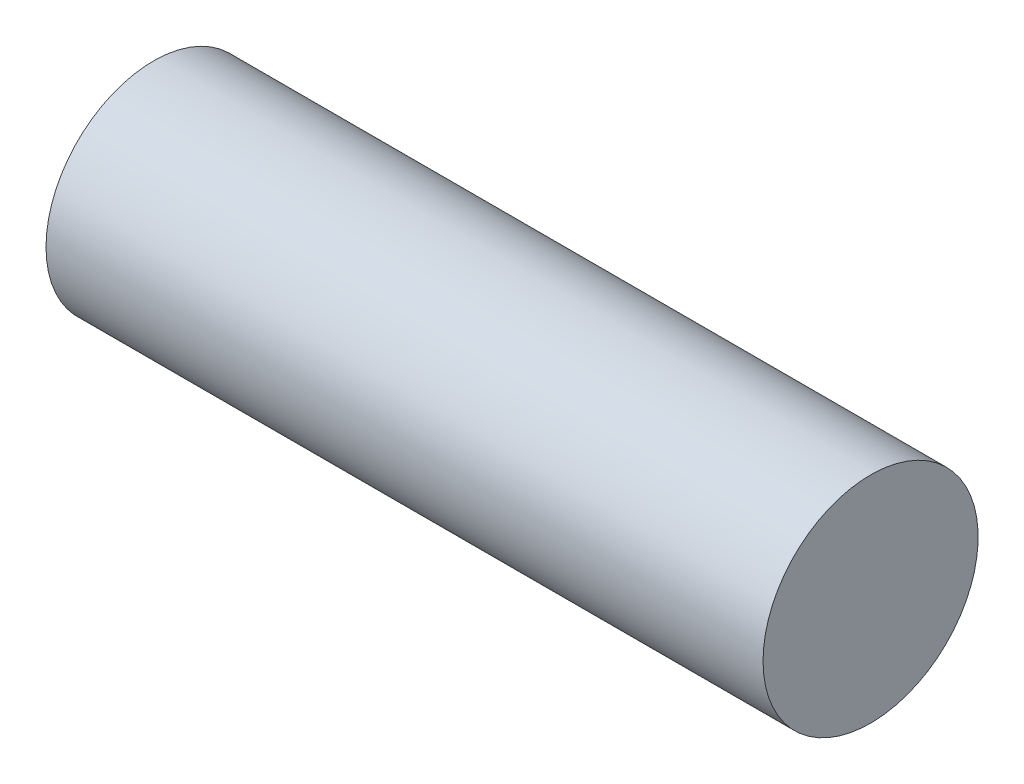
ISO-10303-21;
HEADER;
FILE_DESCRIPTION(('STEP AP214'),'2;1');
FILE_NAME('part.step','',(''),(''),'','','');
FILE_SCHEMA(('AUTOMOTIVE_DESIGN { 1 0 10303 214 1 1 1 1 }'));
ENDSEC;
DATA;
#1=APPLICATION_CONTEXT('core data for automotive mechanical design processes');
#2=APPLICATION_PROTOCOL_DEFINITION('international standard','automotive_design',2000,#1);
#3=PRODUCT_CONTEXT('',#1,'mechanical');
#4=PRODUCT('Part','Part','',(#3));
#5=PRODUCT_RELATED_PRODUCT_CATEGORY('part','',(#4));
#6=PRODUCT_DEFINITION_FORMATION('','',#4);
#7=PRODUCT_DEFINITION_CONTEXT('part definition',#1,'design');
#8=PRODUCT_DEFINITION('design','',#6,#7);
#9=PRODUCT_DEFINITION_SHAPE('','',#8);
#10=(LENGTH_UNIT() NAMED_UNIT(*) SI_UNIT(.MILLI.,.METRE.));
#11=(NAMED_UNIT(*) PLANE_ANGLE_UNIT() SI_UNIT($,.RADIAN.));
#12=(NAMED_UNIT(*) SI_UNIT($,.STERADIAN.) SOLID_ANGLE_UNIT());
#13=UNCERTAINTY_MEASURE_WITH_UNIT(LENGTH_MEASURE(1.E-05),#10,'distance_accuracy_value','');
#14=(GEOMETRIC_REPRESENTATION_CONTEXT(3) GLOBAL_UNCERTAINTY_ASSIGNED_CONTEXT((#13)) GLOBAL_UNIT_ASSIGNED_CONTEXT((#10,
#11,#12)) REPRESENTATION_CONTEXT('',''));
#15=CARTESIAN_POINT('',(0.,0.,0.));
#16=DIRECTION('',(0.,0.,1.));
#17=DIRECTION('',(1.,0.,0.));
#18=AXIS2_PLACEMENT_3D('',#15,#16,#17);
#19=CARTESIAN_POINT('',(-55.9699499165276,6.1,0.));
#20=DIRECTION('',(-1.,0.,0.));
#21=DIRECTION('',(0.,0.,1.));
#22=AXIS2_PLACEMENT_3D('',#19,#20,#21);
#23=PLANE('',#22);
#24=CARTESIAN_POINT('',(-55.9699499165276,6.1,0.));
#25=DIRECTION('',(-1.,0.,0.));
#26=DIRECTION('',(0.,0.,1.));
#27=AXIS2_PLACEMENT_3D('',#24,#25,#26);
#28=CIRCLE('',#27,12.);
#29=CARTESIAN_POINT('',(-55.9699499165276,6.1,12.));
#30=VERTEX_POINT('',#29);
#31=EDGE_CURVE('E10',#30,#30,#28,.T.);
#32=ORIENTED_EDGE('',*,*,#31,.T.);
#33=EDGE_LOOP('',(#32));
#34=FACE_BOUND('',#33,.T.);
#35=ADVANCED_FACE('F31',(#34),#23,.T.);
#36=CARTESIAN_POINT('',(-55.9699499165276,6.1,0.));
#37=DIRECTION('',(-1.,0.,0.));
#38=DIRECTION('',(0.,0.,1.));
#39=AXIS2_PLACEMENT_3D('',#36,#37,#38);
#40=CYLINDRICAL_SURFACE('',#39,12.);
#41=CARTESIAN_POINT('',(24.0300500834724,6.1,0.));
#42=DIRECTION('',(-1.,0.,0.));
#43=DIRECTION('',(0.,0.,1.));
#44=AXIS2_PLACEMENT_3D('',#41,#42,#43);
#45=CIRCLE('',#44,12.);
#46=CARTESIAN_POINT('',(24.0300500834724,6.1,12.));
#47=VERTEX_POINT('',#46);
#48=EDGE_CURVE('E37',#47,#47,#45,.T.);
#49=ORIENTED_EDGE('',*,*,#48,.T.);
#50=EDGE_LOOP('',(#49));
#51=FACE_BOUND('',#50,.T.);
#52=ORIENTED_EDGE('',*,*,#31,.F.);
#53=EDGE_LOOP('',(#52));
#54=FACE_BOUND('',#53,.T.);
#55=ADVANCED_FACE('F43',(#51,#54),#40,.T.);
#56=CARTESIAN_POINT('',(24.0300500834724,6.1,0.));
#57=DIRECTION('',(1.,0.,0.));
#58=DIRECTION('',(0.,0.,-1.));
#59=AXIS2_PLACEMENT_3D('',#56,#57,#58);
#60=PLANE('',#59);
#61=ORIENTED_EDGE('',*,*,#48,.F.);
#62=EDGE_LOOP('',(#61));
#63=FACE_BOUND('',#62,.T.);
#64=ADVANCED_FACE('F46',(#63),#60,.T.);
#65=CLOSED_SHELL('',(#35,#55,#64));
#66=MANIFOLD_SOLID_BREP('B2',#65);
#67=ADVANCED_BREP_SHAPE_REPRESENTATION('',(#18,#66),#14);
#68=SHAPE_DEFINITION_REPRESENTATION(#9,#67);
ENDSEC;
END-ISO-10303-21;
